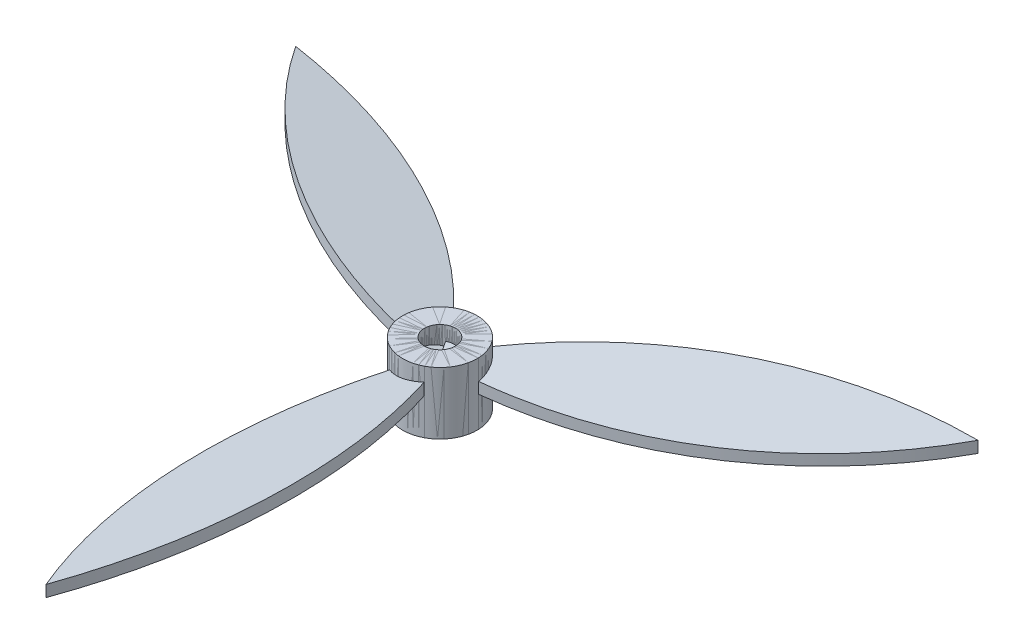
ISO-10303-21;
HEADER;
FILE_DESCRIPTION(('STEP AP214'),'2;1');
FILE_NAME('part.step','',(''),(''),'','','');
FILE_SCHEMA(('AUTOMOTIVE_DESIGN { 1 0 10303 214 1 1 1 1 }'));
ENDSEC;
DATA;
#1=APPLICATION_CONTEXT('core data for automotive mechanical design processes');
#2=APPLICATION_PROTOCOL_DEFINITION('international standard','automotive_design',2000,#1);
#3=PRODUCT_CONTEXT('',#1,'mechanical');
#4=PRODUCT('Part','Part','',(#3));
#5=PRODUCT_RELATED_PRODUCT_CATEGORY('part','',(#4));
#6=PRODUCT_DEFINITION_FORMATION('','',#4);
#7=PRODUCT_DEFINITION_CONTEXT('part definition',#1,'design');
#8=PRODUCT_DEFINITION('design','',#6,#7);
#9=PRODUCT_DEFINITION_SHAPE('','',#8);
#10=(LENGTH_UNIT() NAMED_UNIT(*) SI_UNIT(.MILLI.,.METRE.));
#11=(NAMED_UNIT(*) PLANE_ANGLE_UNIT() SI_UNIT($,.RADIAN.));
#12=(NAMED_UNIT(*) SI_UNIT($,.STERADIAN.) SOLID_ANGLE_UNIT());
#13=UNCERTAINTY_MEASURE_WITH_UNIT(LENGTH_MEASURE(1.E-05),#10,'distance_accuracy_value','');
#14=(GEOMETRIC_REPRESENTATION_CONTEXT(3) GLOBAL_UNCERTAINTY_ASSIGNED_CONTEXT((#13)) GLOBAL_UNIT_ASSIGNED_CONTEXT((#10,
#11,#12)) REPRESENTATION_CONTEXT('',''));
#15=CARTESIAN_POINT('',(0.,0.,0.));
#16=DIRECTION('',(0.,0.,1.));
#17=DIRECTION('',(1.,0.,0.));
#18=AXIS2_PLACEMENT_3D('',#15,#16,#17);
#19=CARTESIAN_POINT('',(16.7891327902085,49.4943574566889,36.4240507759336));
#20=DIRECTION('',(0.0866585890211673,0.984866059825112,-0.150097079096896));
#21=DIRECTION('',(0.492433029912548,-0.173317178042337,-0.852919027133636));
#22=AXIS2_PLACEMENT_3D('',#19,#20,#21);
#23=PLANE('',#22);
#24=CARTESIAN_POINT('',(85.1220420168804,35.3298539377287,-17.0647001118807));
#25=DIRECTION('',(0.0866585890211673,0.984866059825112,-0.150097079096896));
#26=DIRECTION('',(-0.492433029912548,0.173317178042337,0.852919027133636));
#27=AXIS2_PLACEMENT_3D('',#24,#25,#26);
#28=ELLIPSE('',#27,76.945054789548,75.7805729336095);
#29=CARTESIAN_POINT('',(22.7891327902084,47.382591987913,26.0317459305203));
#30=VERTEX_POINT('',#29);
#31=CARTESIAN_POINT('',(71.7868898828023,47.8722241855847,57.53334913679));
#32=VERTEX_POINT('',#31);
#33=EDGE_CURVE('E103',#30,#32,#28,.T.);
#34=ORIENTED_EDGE('',*,*,#33,.F.);
#35=CARTESIAN_POINT('',(16.6329703180013,59.4353300380974,101.561851833808));
#36=DIRECTION('',(0.0866585890211673,0.984866059825112,-0.150097079096896));
#37=DIRECTION('',(-0.492433029912548,0.173317178042337,0.852919027133636));
#38=AXIS2_PLACEMENT_3D('',#35,#36,#37);
#39=ELLIPSE('',#38,76.945054789548,75.7805729336095);
#40=CARTESIAN_POINT('',(74.5691999730728,46.8929597902414,52.7142466980299));
#41=VERTEX_POINT('',#40);
#42=EDGE_CURVE('E90',#30,#41,#39,.F.);
#43=ORIENTED_EDGE('',*,*,#42,.T.);
#44=CARTESIAN_POINT('',(77.7817459305206,47.382591987913,57.7817459305198));
#45=DIRECTION('',(0.0866585890211673,0.984866059825112,-0.150097079096896));
#46=DIRECTION('',(0.492433029912548,-0.173317178042337,-0.852919027133636));
#47=AXIS2_PLACEMENT_3D('',#44,#45,#46);
#48=ELLIPSE('',#47,6.09219897481842,6.);
#49=EDGE_CURVE('E102',#41,#32,#48,.T.);
#50=ORIENTED_EDGE('',*,*,#49,.T.);
#51=EDGE_LOOP('',(#34,#43,#50));
#52=FACE_BOUND('',#51,.T.);
#53=ADVANCED_FACE('F44',(#52),#23,.F.);
#54=CARTESIAN_POINT('',(28.9420742036271,46.8638642813067,15.3745387864843));
#55=DIRECTION('',(-0.094283814011131,-0.982060206739921,0.163304356198657));
#56=DIRECTION('',(-0.491030103369953,0.188567628022265,0.850489087082574));
#57=AXIS2_PLACEMENT_3D('',#54,#55,#56);
#58=PLANE('',#57);
#59=CARTESIAN_POINT('',(85.1220420168804,36.0760015946622,-17.0647001118807));
#60=DIRECTION('',(-0.094283814011131,-0.982060206739921,0.163304356198657));
#61=DIRECTION('',(-0.491030103369953,0.188567628022265,0.850489087082574));
#62=AXIS2_PLACEMENT_3D('',#59,#60,#61);
#63=ELLIPSE('',#62,77.164895200441,75.7805729336095);
#64=CARTESIAN_POINT('',(71.7868898828023,49.7609827369727,57.53334913679));
#65=VERTEX_POINT('',#64);
#66=CARTESIAN_POINT('',(22.7891327902084,49.2267450084261,26.0317459305203));
#67=VERTEX_POINT('',#66);
#68=EDGE_CURVE('E104',#65,#67,#63,.T.);
#69=ORIENTED_EDGE('',*,*,#68,.F.);
#70=CARTESIAN_POINT('',(77.7817459305206,49.2267450084261,57.7817459305198));
#71=DIRECTION('',(-0.094283814011131,-0.982060206739921,0.163304356198657));
#72=DIRECTION('',(0.491030103369953,-0.188567628022265,-0.850489087082574));
#73=AXIS2_PLACEMENT_3D('',#70,#71,#72);
#74=ELLIPSE('',#73,6.1096050515251,6.);
#75=CARTESIAN_POINT('',(74.5691999730728,48.6925072798795,52.7142466980299));
#76=VERTEX_POINT('',#75);
#77=EDGE_CURVE('E109',#65,#76,#74,.T.);
#78=ORIENTED_EDGE('',*,*,#77,.T.);
#79=CARTESIAN_POINT('',(16.6329703180013,62.3774884221901,101.561851833808));
#80=DIRECTION('',(-0.094283814011131,-0.982060206739921,0.163304356198657));
#81=DIRECTION('',(-0.491030103369953,0.188567628022265,0.850489087082574));
#82=AXIS2_PLACEMENT_3D('',#79,#80,#81);
#83=ELLIPSE('',#82,77.164895200441,75.7805729336095);
#84=EDGE_CURVE('E92',#76,#67,#83,.F.);
#85=ORIENTED_EDGE('',*,*,#84,.T.);
#86=EDGE_LOOP('',(#69,#78,#85));
#87=FACE_BOUND('',#86,.T.);
#88=ADVANCED_FACE('F152',(#87),#58,.F.);
#89=CARTESIAN_POINT('',(77.7817459305206,52.,57.7817459305198));
#90=DIRECTION('',(0.,1.,0.));
#91=DIRECTION('',(-0.866025403784443,0.,-0.499999999999992));
#92=AXIS2_PLACEMENT_3D('',#89,#90,#91);
#93=PLANE('',#92);
#94=CARTESIAN_POINT('',(77.7817459305206,52.,57.7817459305198));
#95=DIRECTION('',(0.,1.,0.));
#96=DIRECTION('',(-0.866025403784443,0.,-0.499999999999992));
#97=AXIS2_PLACEMENT_3D('',#94,#95,#96);
#98=CIRCLE('',#97,6.);
#99=CARTESIAN_POINT('',(72.585593507814,52.,54.7817459305199));
#100=VERTEX_POINT('',#99);
#101=EDGE_CURVE('E121',#100,#100,#98,.T.);
#102=ORIENTED_EDGE('',*,*,#101,.T.);
#103=EDGE_LOOP('',(#102));
#104=FACE_BOUND('',#103,.T.);
#105=CARTESIAN_POINT('',(77.7817459305206,52.,57.7817459305198));
#106=DIRECTION('',(0.,1.,0.));
#107=DIRECTION('',(-0.866025403784443,0.,-0.499999999999992));
#108=AXIS2_PLACEMENT_3D('',#105,#106,#107);
#109=CIRCLE('',#108,2.50000000000001);
#110=CARTESIAN_POINT('',(75.6166824210595,52.,56.5317459305198));
#111=VERTEX_POINT('',#110);
#112=EDGE_CURVE('E112',#111,#111,#109,.T.);
#113=ORIENTED_EDGE('',*,*,#112,.F.);
#114=EDGE_LOOP('',(#113));
#115=FACE_BOUND('',#114,.T.);
#116=ADVANCED_FACE('F154',(#104,#115),#93,.T.);
#117=CARTESIAN_POINT('',(77.7817459305206,42.,57.7817459305198));
#118=DIRECTION('',(0.,1.,0.));
#119=DIRECTION('',(-0.866025403784443,0.,-0.499999999999992));
#120=AXIS2_PLACEMENT_3D('',#117,#118,#119);
#121=PLANE('',#120);
#122=CARTESIAN_POINT('',(77.7817459305206,42.,57.7817459305198));
#123=DIRECTION('',(0.,1.,0.));
#124=DIRECTION('',(-0.866025403784443,0.,-0.499999999999992));
#125=AXIS2_PLACEMENT_3D('',#122,#123,#124);
#126=CIRCLE('',#125,6.);
#127=CARTESIAN_POINT('',(72.585593507814,42.,54.7817459305199));
#128=VERTEX_POINT('',#127);
#129=EDGE_CURVE('E119',#128,#128,#126,.T.);
#130=ORIENTED_EDGE('',*,*,#129,.F.);
#131=EDGE_LOOP('',(#130));
#132=FACE_BOUND('',#131,.T.);
#133=CARTESIAN_POINT('',(77.7817459305206,42.,57.7817459305198));
#134=DIRECTION('',(0.,1.,0.));
#135=DIRECTION('',(-0.866025403784443,0.,-0.499999999999992));
#136=AXIS2_PLACEMENT_3D('',#133,#134,#135);
#137=CIRCLE('',#136,2.50000000000001);
#138=CARTESIAN_POINT('',(75.6166824210595,42.,56.5317459305198));
#139=VERTEX_POINT('',#138);
#140=EDGE_CURVE('E108',#139,#139,#137,.T.);
#141=ORIENTED_EDGE('',*,*,#140,.T.);
#142=EDGE_LOOP('',(#141));
#143=FACE_BOUND('',#142,.T.);
#144=ADVANCED_FACE('F160',(#132,#143),#121,.F.);
#145=CARTESIAN_POINT('',(77.7817459305206,52.,57.7817459305198));
#146=DIRECTION('',(0.,-1.,0.));
#147=DIRECTION('',(0.866025403784443,0.,0.499999999999992));
#148=AXIS2_PLACEMENT_3D('',#145,#146,#147);
#149=CYLINDRICAL_SURFACE('',#148,6.);
#150=ORIENTED_EDGE('',*,*,#77,.F.);
#151=DIRECTION('',(0.,1.,0.));
#152=VECTOR('',#151,1.);
#153=CARTESIAN_POINT('',(71.7868898828023,42.,57.53334913679));
#154=LINE('',#153,#152);
#155=EDGE_CURVE('E97',#32,#65,#154,.T.);
#156=ORIENTED_EDGE('',*,*,#155,.F.);
#157=ORIENTED_EDGE('',*,*,#49,.F.);
#158=DIRECTION('',(0.,1.,0.));
#159=VECTOR('',#158,1.);
#160=CARTESIAN_POINT('',(74.5691999730728,42.,52.7142466980299));
#161=LINE('',#160,#159);
#162=EDGE_CURVE('E87',#41,#76,#161,.T.);
#163=ORIENTED_EDGE('',*,*,#162,.T.);
#164=EDGE_LOOP('',(#150,#156,#157,#163));
#165=FACE_BOUND('',#164,.T.);
#166=ORIENTED_EDGE('',*,*,#129,.T.);
#167=EDGE_LOOP('',(#166));
#168=FACE_BOUND('',#167,.T.);
#169=ORIENTED_EDGE('',*,*,#101,.F.);
#170=EDGE_LOOP('',(#169));
#171=FACE_BOUND('',#170,.T.);
#172=ADVANCED_FACE('F46',(#165,#168,#171),#149,.T.);
#173=CARTESIAN_POINT('',(77.7817459305206,52.,57.7817459305198));
#174=DIRECTION('',(0.,-1.,0.));
#175=DIRECTION('',(0.866025403784443,0.,0.499999999999992));
#176=AXIS2_PLACEMENT_3D('',#173,#174,#175);
#177=CYLINDRICAL_SURFACE('',#176,2.50000000000001);
#178=DIRECTION('',(0.,-1.,0.));
#179=VECTOR('',#178,1.);
#180=CARTESIAN_POINT('',(76.5317459305206,52.,59.9468094399809));
#181=LINE('',#180,#179);
#182=CARTESIAN_POINT('',(76.5317459305206,49.7067757303923,59.9468094399809));
#183=VERTEX_POINT('',#182);
#184=CARTESIAN_POINT('',(76.5317459305206,47.8225431272414,59.9468094399809));
#185=VERTEX_POINT('',#184);
#186=EDGE_CURVE('E12',#183,#185,#181,.T.);
#187=ORIENTED_EDGE('',*,*,#186,.F.);
#188=CARTESIAN_POINT('',(77.7817459305206,49.2267450084261,57.7817459305198));
#189=DIRECTION('',(-0.094283814011131,-0.982060206739921,0.163304356198657));
#190=DIRECTION('',(0.491030103369953,-0.188567628022265,-0.850489087082574));
#191=AXIS2_PLACEMENT_3D('',#188,#189,#190);
#192=ELLIPSE('',#191,2.5456687714688,2.50000000000001);
#193=CARTESIAN_POINT('',(79.0317459305206,48.7467142864599,55.6166824210587));
#194=VERTEX_POINT('',#193);
#195=EDGE_CURVE('E129',#183,#194,#192,.T.);
#196=ORIENTED_EDGE('',*,*,#195,.T.);
#197=DIRECTION('',(0.,-1.,0.));
#198=VECTOR('',#197,1.);
#199=CARTESIAN_POINT('',(79.0317459305206,52.,55.6166824210587));
#200=LINE('',#199,#198);
#201=CARTESIAN_POINT('',(79.0317459305206,46.9426408485847,55.6166824210587));
#202=VERTEX_POINT('',#201);
#203=EDGE_CURVE('E124',#202,#194,#200,.F.);
#204=ORIENTED_EDGE('',*,*,#203,.F.);
#205=CARTESIAN_POINT('',(77.7817459305206,47.382591987913,57.7817459305198));
#206=DIRECTION('',(0.0866585890211673,0.984866059825112,-0.150097079096896));
#207=DIRECTION('',(0.492433029912548,-0.173317178042337,-0.852919027133636));
#208=AXIS2_PLACEMENT_3D('',#205,#206,#207);
#209=ELLIPSE('',#208,2.53841623950768,2.50000000000001);
#210=EDGE_CURVE('E52',#202,#185,#209,.T.);
#211=ORIENTED_EDGE('',*,*,#210,.T.);
#212=EDGE_LOOP('',(#187,#196,#204,#211));
#213=FACE_BOUND('',#212,.T.);
#214=ORIENTED_EDGE('',*,*,#112,.T.);
#215=EDGE_LOOP('',(#214));
#216=FACE_BOUND('',#215,.T.);
#217=ORIENTED_EDGE('',*,*,#140,.F.);
#218=EDGE_LOOP('',(#217));
#219=FACE_BOUND('',#218,.T.);
#220=ADVANCED_FACE('F131',(#213,#216,#219),#177,.F.);
#221=CARTESIAN_POINT('',(116.67261889578,0.,-9.57922199601832));
#222=DIRECTION('',(0.866025403784443,0.,0.499999999999992));
#223=DIRECTION('',(0.499999999999992,0.,-0.866025403784443));
#224=AXIS2_PLACEMENT_3D('',#221,#222,#223);
#225=PLANE('',#224);
#226=DIRECTION('',(0.491030103369953,-0.188567628022265,-0.850489087082574));
#227=VECTOR('',#226,1.);
#228=CARTESIAN_POINT('',(83.9346873439392,46.8638642813067,47.1245387864838));
#229=LINE('',#228,#227);
#230=EDGE_CURVE('E114',#183,#194,#229,.T.);
#231=ORIENTED_EDGE('',*,*,#230,.F.);
#232=ORIENTED_EDGE('',*,*,#186,.T.);
#233=DIRECTION('',(-0.492433029912548,0.173317178042337,0.852919027133636));
#234=VECTOR('',#233,1.);
#235=CARTESIAN_POINT('',(71.7817459305207,49.4943574566889,68.1740507759331));
#236=LINE('',#235,#234);
#237=EDGE_CURVE('E140',#202,#185,#236,.T.);
#238=ORIENTED_EDGE('',*,*,#237,.F.);
#239=ORIENTED_EDGE('',*,*,#203,.T.);
#240=EDGE_LOOP('',(#231,#232,#238,#239));
#241=FACE_BOUND('',#240,.T.);
#242=ADVANCED_FACE('F138',(#241),#225,.T.);
#243=ORIENTED_EDGE('',*,*,#195,.F.);
#244=ORIENTED_EDGE('',*,*,#230,.T.);
#245=EDGE_LOOP('',(#243,#244));
#246=FACE_BOUND('',#245,.T.);
#247=ADVANCED_FACE('F141',(#246),#58,.F.);
#248=ORIENTED_EDGE('',*,*,#210,.F.);
#249=ORIENTED_EDGE('',*,*,#237,.T.);
#250=EDGE_LOOP('',(#248,#249));
#251=FACE_BOUND('',#250,.T.);
#252=ADVANCED_FACE('F164',(#251),#23,.F.);
#253=CARTESIAN_POINT('',(85.1220420168804,42.,-17.0647001118807));
#254=DIRECTION('',(0.,1.,0.));
#255=DIRECTION('',(-0.866025403784443,0.,-0.499999999999992));
#256=AXIS2_PLACEMENT_3D('',#253,#254,#255);
#257=CYLINDRICAL_SURFACE('',#256,75.7805729336095);
#258=ORIENTED_EDGE('',*,*,#33,.T.);
#259=ORIENTED_EDGE('',*,*,#155,.T.);
#260=ORIENTED_EDGE('',*,*,#68,.T.);
#261=DIRECTION('',(0.,1.,0.));
#262=VECTOR('',#261,1.);
#263=CARTESIAN_POINT('',(22.7891327902084,42.,26.0317459305203));
#264=LINE('',#263,#262);
#265=EDGE_CURVE('E59',#30,#67,#264,.T.);
#266=ORIENTED_EDGE('',*,*,#265,.F.);
#267=EDGE_LOOP('',(#258,#259,#260,#266));
#268=FACE_BOUND('',#267,.T.);
#269=ADVANCED_FACE('F150',(#268),#257,.T.);
#270=CARTESIAN_POINT('',(16.6329703180013,42.,101.561851833808));
#271=DIRECTION('',(0.,1.,0.));
#272=DIRECTION('',(-0.866025403784443,0.,-0.499999999999992));
#273=AXIS2_PLACEMENT_3D('',#270,#271,#272);
#274=CYLINDRICAL_SURFACE('',#273,75.7805729336095);
#275=ORIENTED_EDGE('',*,*,#265,.T.);
#276=ORIENTED_EDGE('',*,*,#84,.F.);
#277=ORIENTED_EDGE('',*,*,#162,.F.);
#278=ORIENTED_EDGE('',*,*,#42,.F.);
#279=EDGE_LOOP('',(#275,#276,#277,#278));
#280=FACE_BOUND('',#279,.T.);
#281=ADVANCED_FACE('F89',(#280),#274,.T.);
#282=CLOSED_SHELL('',(#53,#88,#116,#144,#172,#220,#242,#247,#252,#269,#281));
#283=MANIFOLD_SOLID_BREP('B2',#282);
#284=CARTESIAN_POINT('',(126.774359070832,49.4943574566889,15.6394410851063));
#285=DIRECTION('',(0.0866585890211694,0.984866059825112,0.150097079096894));
#286=DIRECTION('',(0.49243302991256,-0.173317178042337,0.85291902713363));
#287=AXIS2_PLACEMENT_3D('',#284,#285,#286);
#288=PLANE('',#287);
#289=CARTESIAN_POINT('',(138.930521543041,35.3298539377287,101.561851833807));
#290=DIRECTION('',(0.0866585890211694,0.984866059825112,0.150097079096894));
#291=DIRECTION('',(-0.49243302991256,0.173317178042337,-0.85291902713363));
#292=AXIS2_PLACEMENT_3D('',#289,#290,#291);
#293=ELLIPSE('',#292,76.945054789548,75.7805729336095);
#294=CARTESIAN_POINT('',(132.774359070832,47.382591987913,26.0317459305195));
#295=VERTEX_POINT('',#294);
#296=CARTESIAN_POINT('',(80.9942918879684,47.8722241855847,52.7142466980299));
#297=VERTEX_POINT('',#296);
#298=EDGE_CURVE('E328',#295,#297,#293,.T.);
#299=ORIENTED_EDGE('',*,*,#298,.F.);
#300=CARTESIAN_POINT('',(70.4414498441598,59.4353300380974,-17.0647001118806));
#301=DIRECTION('',(0.0866585890211694,0.984866059825112,0.150097079096894));
#302=DIRECTION('',(-0.49243302991256,0.173317178042337,-0.85291902713363));
#303=AXIS2_PLACEMENT_3D('',#300,#301,#302);
#304=ELLIPSE('',#303,76.945054789548,75.7805729336095);
#305=CARTESIAN_POINT('',(83.7766019782389,46.8929597902414,57.5333491367899));
#306=VERTEX_POINT('',#305);
#307=EDGE_CURVE('E315',#295,#306,#304,.F.);
#308=ORIENTED_EDGE('',*,*,#307,.T.);
#309=CARTESIAN_POINT('',(77.7817459305206,47.382591987913,57.7817459305198));
#310=DIRECTION('',(0.0866585890211694,0.984866059825112,0.150097079096894));
#311=DIRECTION('',(0.49243302991256,-0.173317178042337,0.85291902713363));
#312=AXIS2_PLACEMENT_3D('',#309,#310,#311);
#313=ELLIPSE('',#312,6.09219897481842,6.);
#314=EDGE_CURVE('E327',#306,#297,#313,.T.);
#315=ORIENTED_EDGE('',*,*,#314,.T.);
#316=EDGE_LOOP('',(#299,#308,#315));
#317=FACE_BOUND('',#316,.T.);
#318=ADVANCED_FACE('F269',(#317),#288,.F.);
#319=CARTESIAN_POINT('',(138.927300484251,46.8638642813067,36.6889530745554));
#320=DIRECTION('',(-0.0942838140111333,-0.982060206739921,-0.163304356198655));
#321=DIRECTION('',(-0.491030103369965,0.188567628022265,-0.850489087082567));
#322=AXIS2_PLACEMENT_3D('',#319,#320,#321);
#323=PLANE('',#322);
#324=CARTESIAN_POINT('',(138.930521543041,36.0760015946622,101.561851833807));
#325=DIRECTION('',(-0.0942838140111333,-0.982060206739921,-0.163304356198655));
#326=DIRECTION('',(-0.491030103369965,0.188567628022265,-0.850489087082567));
#327=AXIS2_PLACEMENT_3D('',#324,#325,#326);
#328=ELLIPSE('',#327,77.164895200441,75.7805729336095);
#329=CARTESIAN_POINT('',(80.9942918879684,49.7609827369727,52.7142466980299));
#330=VERTEX_POINT('',#329);
#331=CARTESIAN_POINT('',(132.774359070832,49.2267450084261,26.0317459305195));
#332=VERTEX_POINT('',#331);
#333=EDGE_CURVE('E329',#330,#332,#328,.T.);
#334=ORIENTED_EDGE('',*,*,#333,.F.);
#335=CARTESIAN_POINT('',(77.7817459305206,49.2267450084261,57.7817459305198));
#336=DIRECTION('',(-0.0942838140111333,-0.982060206739921,-0.163304356198655));
#337=DIRECTION('',(0.491030103369965,-0.188567628022265,0.850489087082567));
#338=AXIS2_PLACEMENT_3D('',#335,#336,#337);
#339=ELLIPSE('',#338,6.1096050515251,6.);
#340=CARTESIAN_POINT('',(83.7766019782389,48.6925072798795,57.5333491367899));
#341=VERTEX_POINT('',#340);
#342=EDGE_CURVE('E334',#330,#341,#339,.T.);
#343=ORIENTED_EDGE('',*,*,#342,.T.);
#344=CARTESIAN_POINT('',(70.4414498441598,62.3774884221901,-17.0647001118806));
#345=DIRECTION('',(-0.0942838140111333,-0.982060206739921,-0.163304356198655));
#346=DIRECTION('',(-0.491030103369965,0.188567628022265,-0.850489087082567));
#347=AXIS2_PLACEMENT_3D('',#344,#345,#346);
#348=ELLIPSE('',#347,77.164895200441,75.7805729336095);
#349=EDGE_CURVE('E317',#341,#332,#348,.F.);
#350=ORIENTED_EDGE('',*,*,#349,.T.);
#351=EDGE_LOOP('',(#334,#343,#350));
#352=FACE_BOUND('',#351,.T.);
#353=ADVANCED_FACE('F377',(#352),#323,.F.);
#354=CARTESIAN_POINT('',(77.7817459305206,52.,57.7817459305198));
#355=DIRECTION('',(0.,1.,0.));
#356=DIRECTION('',(0.866025403784436,0.,-0.500000000000004));
#357=AXIS2_PLACEMENT_3D('',#354,#355,#356);
#358=PLANE('',#357);
#359=CARTESIAN_POINT('',(77.7817459305206,52.,57.7817459305198));
#360=DIRECTION('',(0.,1.,0.));
#361=DIRECTION('',(0.866025403784436,0.,-0.500000000000004));
#362=AXIS2_PLACEMENT_3D('',#359,#360,#361);
#363=CIRCLE('',#362,6.);
#364=CARTESIAN_POINT('',(82.9778983532272,52.,54.7817459305198));
#365=VERTEX_POINT('',#364);
#366=EDGE_CURVE('E346',#365,#365,#363,.T.);
#367=ORIENTED_EDGE('',*,*,#366,.T.);
#368=EDGE_LOOP('',(#367));
#369=FACE_BOUND('',#368,.T.);
#370=CARTESIAN_POINT('',(77.7817459305206,52.,57.7817459305198));
#371=DIRECTION('',(0.,1.,0.));
#372=DIRECTION('',(0.866025403784436,0.,-0.500000000000004));
#373=AXIS2_PLACEMENT_3D('',#370,#371,#372);
#374=CIRCLE('',#373,2.50000000000001);
#375=CARTESIAN_POINT('',(79.9468094399817,52.,56.5317459305198));
#376=VERTEX_POINT('',#375);
#377=EDGE_CURVE('E337',#376,#376,#374,.T.);
#378=ORIENTED_EDGE('',*,*,#377,.F.);
#379=EDGE_LOOP('',(#378));
#380=FACE_BOUND('',#379,.T.);
#381=ADVANCED_FACE('F379',(#369,#380),#358,.T.);
#382=CARTESIAN_POINT('',(77.7817459305206,42.,57.7817459305198));
#383=DIRECTION('',(0.,1.,0.));
#384=DIRECTION('',(0.866025403784436,0.,-0.500000000000004));
#385=AXIS2_PLACEMENT_3D('',#382,#383,#384);
#386=PLANE('',#385);
#387=CARTESIAN_POINT('',(77.7817459305206,42.,57.7817459305198));
#388=DIRECTION('',(0.,1.,0.));
#389=DIRECTION('',(0.866025403784436,0.,-0.500000000000004));
#390=AXIS2_PLACEMENT_3D('',#387,#388,#389);
#391=CIRCLE('',#390,6.);
#392=CARTESIAN_POINT('',(82.9778983532272,42.,54.7817459305198));
#393=VERTEX_POINT('',#392);
#394=EDGE_CURVE('E344',#393,#393,#391,.T.);
#395=ORIENTED_EDGE('',*,*,#394,.F.);
#396=EDGE_LOOP('',(#395));
#397=FACE_BOUND('',#396,.T.);
#398=CARTESIAN_POINT('',(77.7817459305206,42.,57.7817459305198));
#399=DIRECTION('',(0.,1.,0.));
#400=DIRECTION('',(0.866025403784436,0.,-0.500000000000004));
#401=AXIS2_PLACEMENT_3D('',#398,#399,#400);
#402=CIRCLE('',#401,2.50000000000001);
#403=CARTESIAN_POINT('',(79.9468094399817,42.,56.5317459305198));
#404=VERTEX_POINT('',#403);
#405=EDGE_CURVE('E333',#404,#404,#402,.T.);
#406=ORIENTED_EDGE('',*,*,#405,.T.);
#407=EDGE_LOOP('',(#406));
#408=FACE_BOUND('',#407,.T.);
#409=ADVANCED_FACE('F385',(#397,#408),#386,.F.);
#410=CARTESIAN_POINT('',(77.7817459305206,52.,57.7817459305198));
#411=DIRECTION('',(0.,-1.,0.));
#412=DIRECTION('',(-0.866025403784436,0.,0.500000000000004));
#413=AXIS2_PLACEMENT_3D('',#410,#411,#412);
#414=CYLINDRICAL_SURFACE('',#413,6.);
#415=ORIENTED_EDGE('',*,*,#342,.F.);
#416=DIRECTION('',(0.,1.,0.));
#417=VECTOR('',#416,1.);
#418=CARTESIAN_POINT('',(80.9942918879684,42.,52.7142466980299));
#419=LINE('',#418,#417);
#420=EDGE_CURVE('E322',#297,#330,#419,.T.);
#421=ORIENTED_EDGE('',*,*,#420,.F.);
#422=ORIENTED_EDGE('',*,*,#314,.F.);
#423=DIRECTION('',(0.,1.,0.));
#424=VECTOR('',#423,1.);
#425=CARTESIAN_POINT('',(83.7766019782389,42.,57.5333491367899));
#426=LINE('',#425,#424);
#427=EDGE_CURVE('E312',#306,#341,#426,.T.);
#428=ORIENTED_EDGE('',*,*,#427,.T.);
#429=EDGE_LOOP('',(#415,#421,#422,#428));
#430=FACE_BOUND('',#429,.T.);
#431=ORIENTED_EDGE('',*,*,#394,.T.);
#432=EDGE_LOOP('',(#431));
#433=FACE_BOUND('',#432,.T.);
#434=ORIENTED_EDGE('',*,*,#366,.F.);
#435=EDGE_LOOP('',(#434));
#436=FACE_BOUND('',#435,.T.);
#437=ADVANCED_FACE('F271',(#430,#433,#436),#414,.T.);
#438=CARTESIAN_POINT('',(77.7817459305206,52.,57.7817459305198));
#439=DIRECTION('',(0.,-1.,0.));
#440=DIRECTION('',(-0.866025403784436,0.,0.500000000000004));
#441=AXIS2_PLACEMENT_3D('',#438,#439,#440);
#442=CYLINDRICAL_SURFACE('',#441,2.50000000000001);
#443=DIRECTION('',(0.,-1.,0.));
#444=VECTOR('',#443,1.);
#445=CARTESIAN_POINT('',(76.5317459305207,52.,55.6166824210587));
#446=LINE('',#445,#444);
#447=CARTESIAN_POINT('',(76.5317459305207,49.7067757303923,55.6166824210587));
#448=VERTEX_POINT('',#447);
#449=CARTESIAN_POINT('',(76.5317459305207,47.8225431272414,55.6166824210587));
#450=VERTEX_POINT('',#449);
#451=EDGE_CURVE('E42',#448,#450,#446,.T.);
#452=ORIENTED_EDGE('',*,*,#451,.F.);
#453=CARTESIAN_POINT('',(77.7817459305206,49.2267450084261,57.7817459305198));
#454=DIRECTION('',(-0.0942838140111333,-0.982060206739921,-0.163304356198655));
#455=DIRECTION('',(0.491030103369965,-0.188567628022265,0.850489087082567));
#456=AXIS2_PLACEMENT_3D('',#453,#454,#455);
#457=ELLIPSE('',#456,2.5456687714688,2.50000000000001);
#458=CARTESIAN_POINT('',(79.0317459305207,48.7467142864599,59.9468094399809));
#459=VERTEX_POINT('',#458);
#460=EDGE_CURVE('E354',#448,#459,#457,.T.);
#461=ORIENTED_EDGE('',*,*,#460,.T.);
#462=DIRECTION('',(0.,-1.,0.));
#463=VECTOR('',#462,1.);
#464=CARTESIAN_POINT('',(79.0317459305207,52.,59.9468094399809));
#465=LINE('',#464,#463);
#466=CARTESIAN_POINT('',(79.0317459305207,46.9426408485847,59.9468094399809));
#467=VERTEX_POINT('',#466);
#468=EDGE_CURVE('E349',#467,#459,#465,.F.);
#469=ORIENTED_EDGE('',*,*,#468,.F.);
#470=CARTESIAN_POINT('',(77.7817459305206,47.382591987913,57.7817459305198));
#471=DIRECTION('',(0.0866585890211694,0.984866059825112,0.150097079096894));
#472=DIRECTION('',(0.49243302991256,-0.173317178042337,0.85291902713363));
#473=AXIS2_PLACEMENT_3D('',#470,#471,#472);
#474=ELLIPSE('',#473,2.53841623950768,2.50000000000001);
#475=EDGE_CURVE('E277',#467,#450,#474,.T.);
#476=ORIENTED_EDGE('',*,*,#475,.T.);
#477=EDGE_LOOP('',(#452,#461,#469,#476));
#478=FACE_BOUND('',#477,.T.);
#479=ORIENTED_EDGE('',*,*,#377,.T.);
#480=EDGE_LOOP('',(#479));
#481=FACE_BOUND('',#480,.T.);
#482=ORIENTED_EDGE('',*,*,#405,.F.);
#483=EDGE_LOOP('',(#482));
#484=FACE_BOUND('',#483,.T.);
#485=ADVANCED_FACE('F356',(#478,#481,#484),#442,.F.);
#486=CARTESIAN_POINT('',(116.672618895781,0.,125.142713857057));
#487=DIRECTION('',(-0.866025403784436,0.,0.500000000000004));
#488=DIRECTION('',(0.500000000000004,0.,0.866025403784436));
#489=AXIS2_PLACEMENT_3D('',#486,#487,#488);
#490=PLANE('',#489);
#491=DIRECTION('',(0.491030103369965,-0.188567628022265,0.850489087082567));
#492=VECTOR('',#491,1.);
#493=CARTESIAN_POINT('',(83.9346873439395,46.8638642813067,68.4389530745557));
#494=LINE('',#493,#492);
#495=EDGE_CURVE('E339',#448,#459,#494,.T.);
#496=ORIENTED_EDGE('',*,*,#495,.F.);
#497=ORIENTED_EDGE('',*,*,#451,.T.);
#498=DIRECTION('',(-0.49243302991256,0.173317178042337,-0.85291902713363));
#499=VECTOR('',#498,1.);
#500=CARTESIAN_POINT('',(71.7817459305206,49.4943574566889,47.3894410851065));
#501=LINE('',#500,#499);
#502=EDGE_CURVE('E365',#467,#450,#501,.T.);
#503=ORIENTED_EDGE('',*,*,#502,.F.);
#504=ORIENTED_EDGE('',*,*,#468,.T.);
#505=EDGE_LOOP('',(#496,#497,#503,#504));
#506=FACE_BOUND('',#505,.T.);
#507=ADVANCED_FACE('F363',(#506),#490,.T.);
#508=ORIENTED_EDGE('',*,*,#460,.F.);
#509=ORIENTED_EDGE('',*,*,#495,.T.);
#510=EDGE_LOOP('',(#508,#509));
#511=FACE_BOUND('',#510,.T.);
#512=ADVANCED_FACE('F366',(#511),#323,.F.);
#513=ORIENTED_EDGE('',*,*,#475,.F.);
#514=ORIENTED_EDGE('',*,*,#502,.T.);
#515=EDGE_LOOP('',(#513,#514));
#516=FACE_BOUND('',#515,.T.);
#517=ADVANCED_FACE('F389',(#516),#288,.F.);
#518=CARTESIAN_POINT('',(138.930521543041,42.,101.561851833807));
#519=DIRECTION('',(0.,1.,0.));
#520=DIRECTION('',(0.866025403784436,0.,-0.500000000000004));
#521=AXIS2_PLACEMENT_3D('',#518,#519,#520);
#522=CYLINDRICAL_SURFACE('',#521,75.7805729336095);
#523=ORIENTED_EDGE('',*,*,#298,.T.);
#524=ORIENTED_EDGE('',*,*,#420,.T.);
#525=ORIENTED_EDGE('',*,*,#333,.T.);
#526=DIRECTION('',(0.,1.,0.));
#527=VECTOR('',#526,1.);
#528=CARTESIAN_POINT('',(132.774359070832,42.,26.0317459305195));
#529=LINE('',#528,#527);
#530=EDGE_CURVE('E284',#295,#332,#529,.T.);
#531=ORIENTED_EDGE('',*,*,#530,.F.);
#532=EDGE_LOOP('',(#523,#524,#525,#531));
#533=FACE_BOUND('',#532,.T.);
#534=ADVANCED_FACE('F375',(#533),#522,.T.);
#535=CARTESIAN_POINT('',(70.4414498441598,42.,-17.0647001118806));
#536=DIRECTION('',(0.,1.,0.));
#537=DIRECTION('',(0.866025403784436,0.,-0.500000000000004));
#538=AXIS2_PLACEMENT_3D('',#535,#536,#537);
#539=CYLINDRICAL_SURFACE('',#538,75.7805729336095);
#540=ORIENTED_EDGE('',*,*,#530,.T.);
#541=ORIENTED_EDGE('',*,*,#349,.F.);
#542=ORIENTED_EDGE('',*,*,#427,.F.);
#543=ORIENTED_EDGE('',*,*,#307,.F.);
#544=EDGE_LOOP('',(#540,#541,#542,#543));
#545=FACE_BOUND('',#544,.T.);
#546=ADVANCED_FACE('F314',(#545),#539,.T.);
#547=CLOSED_SHELL('',(#318,#353,#381,#409,#437,#485,#507,#512,#517,#534,#546));
#548=MANIFOLD_SOLID_BREP('B6',#547);
#549=CARTESIAN_POINT('',(89.7817459305206,49.4943574566889,121.28174593052));
#550=DIRECTION('',(-0.173317178042337,0.984866059825112,0.));
#551=DIRECTION('',(-0.984866059825112,-0.173317178042337,0.));
#552=AXIS2_PLACEMENT_3D('',#549,#550,#551);
#553=PLANE('',#552);
#554=CARTESIAN_POINT('',(9.29267423164037,35.3298539377287,88.8480860696324));
#555=DIRECTION('',(-0.173317178042337,0.984866059825112,0.));
#556=DIRECTION('',(0.984866059825112,0.173317178042337,0.));
#557=AXIS2_PLACEMENT_3D('',#554,#555,#556);
#558=ELLIPSE('',#557,76.945054789548,75.7805729336095);
#559=CARTESIAN_POINT('',(77.7817459305206,47.382591987913,121.28174593052));
#560=VERTEX_POINT('',#559);
#561=CARTESIAN_POINT('',(80.5640560207911,47.8722241855847,63.0976419567396));
#562=VERTEX_POINT('',#561);
#563=EDGE_CURVE('E544',#560,#562,#558,.T.);
#564=ORIENTED_EDGE('',*,*,#563,.F.);
#565=CARTESIAN_POINT('',(146.270817629401,59.4353300380974,88.8480860696324));
#566=DIRECTION('',(-0.173317178042337,0.984866059825112,0.));
#567=DIRECTION('',(0.984866059825112,0.173317178042337,0.));
#568=AXIS2_PLACEMENT_3D('',#565,#566,#567);
#569=ELLIPSE('',#568,76.945054789548,75.7805729336095);
#570=CARTESIAN_POINT('',(74.9994358402501,46.8929597902414,63.0976419567396));
#571=VERTEX_POINT('',#570);
#572=EDGE_CURVE('E531',#560,#571,#569,.F.);
#573=ORIENTED_EDGE('',*,*,#572,.T.);
#574=CARTESIAN_POINT('',(77.7817459305206,47.382591987913,57.7817459305198));
#575=DIRECTION('',(-0.173317178042337,0.984866059825112,0.));
#576=DIRECTION('',(-0.984866059825112,-0.173317178042337,0.));
#577=AXIS2_PLACEMENT_3D('',#574,#575,#576);
#578=ELLIPSE('',#577,6.09219897481842,6.);
#579=EDGE_CURVE('E543',#571,#562,#578,.T.);
#580=ORIENTED_EDGE('',*,*,#579,.T.);
#581=EDGE_LOOP('',(#564,#573,#580));
#582=FACE_BOUND('',#581,.T.);
#583=ADVANCED_FACE('F485',(#582),#553,.F.);
#584=CARTESIAN_POINT('',(65.4758631036832,46.8638642813067,121.28174593052));
#585=DIRECTION('',(0.188567628022265,-0.982060206739921,0.));
#586=DIRECTION('',(0.982060206739921,0.188567628022265,0.));
#587=AXIS2_PLACEMENT_3D('',#584,#585,#586);
#588=PLANE('',#587);
#589=CARTESIAN_POINT('',(9.29267423164037,36.0760015946622,88.8480860696324));
#590=DIRECTION('',(0.188567628022265,-0.982060206739921,0.));
#591=DIRECTION('',(0.982060206739921,0.188567628022265,0.));
#592=AXIS2_PLACEMENT_3D('',#589,#590,#591);
#593=ELLIPSE('',#592,77.164895200441,75.7805729336095);
#594=CARTESIAN_POINT('',(80.5640560207911,49.7609827369727,63.0976419567396));
#595=VERTEX_POINT('',#594);
#596=CARTESIAN_POINT('',(77.7817459305206,49.2267450084261,121.28174593052));
#597=VERTEX_POINT('',#596);
#598=EDGE_CURVE('E545',#595,#597,#593,.T.);
#599=ORIENTED_EDGE('',*,*,#598,.F.);
#600=CARTESIAN_POINT('',(77.7817459305206,49.2267450084261,57.7817459305198));
#601=DIRECTION('',(0.188567628022265,-0.982060206739921,0.));
#602=DIRECTION('',(-0.982060206739921,-0.188567628022265,0.));
#603=AXIS2_PLACEMENT_3D('',#600,#601,#602);
#604=ELLIPSE('',#603,6.1096050515251,6.);
#605=CARTESIAN_POINT('',(74.9994358402501,48.6925072798795,63.0976419567396));
#606=VERTEX_POINT('',#605);
#607=EDGE_CURVE('E550',#595,#606,#604,.T.);
#608=ORIENTED_EDGE('',*,*,#607,.T.);
#609=CARTESIAN_POINT('',(146.270817629401,62.3774884221901,88.8480860696324));
#610=DIRECTION('',(0.188567628022265,-0.982060206739921,0.));
#611=DIRECTION('',(0.982060206739921,0.188567628022265,0.));
#612=AXIS2_PLACEMENT_3D('',#609,#610,#611);
#613=ELLIPSE('',#612,77.164895200441,75.7805729336095);
#614=EDGE_CURVE('E533',#606,#597,#613,.F.);
#615=ORIENTED_EDGE('',*,*,#614,.T.);
#616=EDGE_LOOP('',(#599,#608,#615));
#617=FACE_BOUND('',#616,.T.);
#618=ADVANCED_FACE('F593',(#617),#588,.F.);
#619=CARTESIAN_POINT('',(77.7817459305206,52.,57.7817459305198));
#620=DIRECTION('',(0.,1.,0.));
#621=DIRECTION('',(0.,0.,1.));
#622=AXIS2_PLACEMENT_3D('',#619,#620,#621);
#623=PLANE('',#622);
#624=CARTESIAN_POINT('',(77.7817459305206,52.,57.7817459305198));
#625=DIRECTION('',(0.,1.,0.));
#626=DIRECTION('',(0.,0.,1.));
#627=AXIS2_PLACEMENT_3D('',#624,#625,#626);
#628=CIRCLE('',#627,6.);
#629=CARTESIAN_POINT('',(77.7817459305206,52.,63.7817459305198));
#630=VERTEX_POINT('',#629);
#631=EDGE_CURVE('E562',#630,#630,#628,.T.);
#632=ORIENTED_EDGE('',*,*,#631,.T.);
#633=EDGE_LOOP('',(#632));
#634=FACE_BOUND('',#633,.T.);
#635=CARTESIAN_POINT('',(77.7817459305206,52.,57.7817459305198));
#636=DIRECTION('',(0.,1.,0.));
#637=DIRECTION('',(0.,0.,1.));
#638=AXIS2_PLACEMENT_3D('',#635,#636,#637);
#639=CIRCLE('',#638,2.50000000000001);
#640=CARTESIAN_POINT('',(77.7817459305206,52.,60.2817459305198));
#641=VERTEX_POINT('',#640);
#642=EDGE_CURVE('E553',#641,#641,#639,.T.);
#643=ORIENTED_EDGE('',*,*,#642,.F.);
#644=EDGE_LOOP('',(#643));
#645=FACE_BOUND('',#644,.T.);
#646=ADVANCED_FACE('F595',(#634,#645),#623,.T.);
#647=CARTESIAN_POINT('',(77.7817459305206,42.,57.7817459305198));
#648=DIRECTION('',(0.,1.,0.));
#649=DIRECTION('',(0.,0.,1.));
#650=AXIS2_PLACEMENT_3D('',#647,#648,#649);
#651=PLANE('',#650);
#652=CARTESIAN_POINT('',(77.7817459305206,42.,57.7817459305198));
#653=DIRECTION('',(0.,1.,0.));
#654=DIRECTION('',(0.,0.,1.));
#655=AXIS2_PLACEMENT_3D('',#652,#653,#654);
#656=CIRCLE('',#655,6.);
#657=CARTESIAN_POINT('',(77.7817459305206,42.,63.7817459305198));
#658=VERTEX_POINT('',#657);
#659=EDGE_CURVE('E560',#658,#658,#656,.T.);
#660=ORIENTED_EDGE('',*,*,#659,.F.);
#661=EDGE_LOOP('',(#660));
#662=FACE_BOUND('',#661,.T.);
#663=CARTESIAN_POINT('',(77.7817459305206,42.,57.7817459305198));
#664=DIRECTION('',(0.,1.,0.));
#665=DIRECTION('',(0.,0.,1.));
#666=AXIS2_PLACEMENT_3D('',#663,#664,#665);
#667=CIRCLE('',#666,2.50000000000001);
#668=CARTESIAN_POINT('',(77.7817459305206,42.,60.2817459305198));
#669=VERTEX_POINT('',#668);
#670=EDGE_CURVE('E549',#669,#669,#667,.T.);
#671=ORIENTED_EDGE('',*,*,#670,.T.);
#672=EDGE_LOOP('',(#671));
#673=FACE_BOUND('',#672,.T.);
#674=ADVANCED_FACE('F601',(#662,#673),#651,.F.);
#675=CARTESIAN_POINT('',(77.7817459305206,52.,57.7817459305198));
#676=DIRECTION('',(0.,-1.,0.));
#677=DIRECTION('',(0.,0.,-1.));
#678=AXIS2_PLACEMENT_3D('',#675,#676,#677);
#679=CYLINDRICAL_SURFACE('',#678,6.);
#680=ORIENTED_EDGE('',*,*,#607,.F.);
#681=DIRECTION('',(0.,1.,0.));
#682=VECTOR('',#681,1.);
#683=CARTESIAN_POINT('',(80.5640560207911,42.,63.0976419567396));
#684=LINE('',#683,#682);
#685=EDGE_CURVE('E538',#562,#595,#684,.T.);
#686=ORIENTED_EDGE('',*,*,#685,.F.);
#687=ORIENTED_EDGE('',*,*,#579,.F.);
#688=DIRECTION('',(0.,1.,0.));
#689=VECTOR('',#688,1.);
#690=CARTESIAN_POINT('',(74.9994358402501,42.,63.0976419567396));
#691=LINE('',#690,#689);
#692=EDGE_CURVE('E528',#571,#606,#691,.T.);
#693=ORIENTED_EDGE('',*,*,#692,.T.);
#694=EDGE_LOOP('',(#680,#686,#687,#693));
#695=FACE_BOUND('',#694,.T.);
#696=ORIENTED_EDGE('',*,*,#659,.T.);
#697=EDGE_LOOP('',(#696));
#698=FACE_BOUND('',#697,.T.);
#699=ORIENTED_EDGE('',*,*,#631,.F.);
#700=EDGE_LOOP('',(#699));
#701=FACE_BOUND('',#700,.T.);
#702=ADVANCED_FACE('F487',(#695,#698,#701),#679,.T.);
#703=CARTESIAN_POINT('',(77.7817459305206,52.,57.7817459305198));
#704=DIRECTION('',(0.,-1.,0.));
#705=DIRECTION('',(0.,0.,-1.));
#706=AXIS2_PLACEMENT_3D('',#703,#704,#705);
#707=CYLINDRICAL_SURFACE('',#706,2.50000000000001);
#708=DIRECTION('',(0.,-1.,0.));
#709=VECTOR('',#708,1.);
#710=CARTESIAN_POINT('',(80.2817459305206,52.,57.7817459305199));
#711=LINE('',#710,#709);
#712=CARTESIAN_POINT('',(80.2817459305206,49.7067757303923,57.7817459305199));
#713=VERTEX_POINT('',#712);
#714=CARTESIAN_POINT('',(80.2817459305206,47.8225431272414,57.7817459305199));
#715=VERTEX_POINT('',#714);
#716=EDGE_CURVE('E267',#713,#715,#711,.T.);
#717=ORIENTED_EDGE('',*,*,#716,.F.);
#718=CARTESIAN_POINT('',(77.7817459305206,49.2267450084261,57.7817459305198));
#719=DIRECTION('',(0.188567628022265,-0.982060206739921,0.));
#720=DIRECTION('',(-0.982060206739921,-0.188567628022265,0.));
#721=AXIS2_PLACEMENT_3D('',#718,#719,#720);
#722=ELLIPSE('',#721,2.5456687714688,2.50000000000001);
#723=CARTESIAN_POINT('',(75.2817459305206,48.7467142864599,57.7817459305199));
#724=VERTEX_POINT('',#723);
#725=EDGE_CURVE('E570',#713,#724,#722,.T.);
#726=ORIENTED_EDGE('',*,*,#725,.T.);
#727=DIRECTION('',(0.,-1.,0.));
#728=VECTOR('',#727,1.);
#729=CARTESIAN_POINT('',(75.2817459305206,52.,57.7817459305199));
#730=LINE('',#729,#728);
#731=CARTESIAN_POINT('',(75.2817459305206,46.9426408485847,57.7817459305199));
#732=VERTEX_POINT('',#731);
#733=EDGE_CURVE('E565',#732,#724,#730,.F.);
#734=ORIENTED_EDGE('',*,*,#733,.F.);
#735=CARTESIAN_POINT('',(77.7817459305206,47.382591987913,57.7817459305198));
#736=DIRECTION('',(-0.173317178042337,0.984866059825112,0.));
#737=DIRECTION('',(-0.984866059825112,-0.173317178042337,0.));
#738=AXIS2_PLACEMENT_3D('',#735,#736,#737);
#739=ELLIPSE('',#738,2.53841623950768,2.50000000000001);
#740=EDGE_CURVE('E493',#732,#715,#739,.T.);
#741=ORIENTED_EDGE('',*,*,#740,.T.);
#742=EDGE_LOOP('',(#717,#726,#734,#741));
#743=FACE_BOUND('',#742,.T.);
#744=ORIENTED_EDGE('',*,*,#642,.T.);
#745=EDGE_LOOP('',(#744));
#746=FACE_BOUND('',#745,.T.);
#747=ORIENTED_EDGE('',*,*,#670,.F.);
#748=EDGE_LOOP('',(#747));
#749=FACE_BOUND('',#748,.T.);
#750=ADVANCED_FACE('F572',(#743,#746,#749),#707,.F.);
#751=CARTESIAN_POINT('',(0.,0.,57.7817459305199));
#752=DIRECTION('',(0.,0.,-1.));
#753=DIRECTION('',(-1.,0.,0.));
#754=AXIS2_PLACEMENT_3D('',#751,#752,#753);
#755=PLANE('',#754);
#756=DIRECTION('',(-0.982060206739921,-0.188567628022265,0.));
#757=VECTOR('',#756,1.);
#758=CARTESIAN_POINT('',(65.4758631036832,46.8638642813067,57.7817459305199));
#759=LINE('',#758,#757);
#760=EDGE_CURVE('E555',#713,#724,#759,.T.);
#761=ORIENTED_EDGE('',*,*,#760,.F.);
#762=ORIENTED_EDGE('',*,*,#716,.T.);
#763=DIRECTION('',(0.984866059825112,0.173317178042337,0.));
#764=VECTOR('',#763,1.);
#765=CARTESIAN_POINT('',(89.7817459305206,49.4943574566889,57.7817459305199));
#766=LINE('',#765,#764);
#767=EDGE_CURVE('E581',#732,#715,#766,.T.);
#768=ORIENTED_EDGE('',*,*,#767,.F.);
#769=ORIENTED_EDGE('',*,*,#733,.T.);
#770=EDGE_LOOP('',(#761,#762,#768,#769));
#771=FACE_BOUND('',#770,.T.);
#772=ADVANCED_FACE('F579',(#771),#755,.T.);
#773=ORIENTED_EDGE('',*,*,#725,.F.);
#774=ORIENTED_EDGE('',*,*,#760,.T.);
#775=EDGE_LOOP('',(#773,#774));
#776=FACE_BOUND('',#775,.T.);
#777=ADVANCED_FACE('F582',(#776),#588,.F.);
#778=ORIENTED_EDGE('',*,*,#740,.F.);
#779=ORIENTED_EDGE('',*,*,#767,.T.);
#780=EDGE_LOOP('',(#778,#779));
#781=FACE_BOUND('',#780,.T.);
#782=ADVANCED_FACE('F605',(#781),#553,.F.);
#783=CARTESIAN_POINT('',(9.29267423164037,42.,88.8480860696324));
#784=DIRECTION('',(0.,1.,0.));
#785=DIRECTION('',(0.,0.,1.));
#786=AXIS2_PLACEMENT_3D('',#783,#784,#785);
#787=CYLINDRICAL_SURFACE('',#786,75.7805729336095);
#788=ORIENTED_EDGE('',*,*,#563,.T.);
#789=ORIENTED_EDGE('',*,*,#685,.T.);
#790=ORIENTED_EDGE('',*,*,#598,.T.);
#791=DIRECTION('',(0.,1.,0.));
#792=VECTOR('',#791,1.);
#793=CARTESIAN_POINT('',(77.7817459305206,42.,121.28174593052));
#794=LINE('',#793,#792);
#795=EDGE_CURVE('E500',#560,#597,#794,.T.);
#796=ORIENTED_EDGE('',*,*,#795,.F.);
#797=EDGE_LOOP('',(#788,#789,#790,#796));
#798=FACE_BOUND('',#797,.T.);
#799=ADVANCED_FACE('F591',(#798),#787,.T.);
#800=CARTESIAN_POINT('',(146.270817629401,42.,88.8480860696324));
#801=DIRECTION('',(0.,1.,0.));
#802=DIRECTION('',(0.,0.,1.));
#803=AXIS2_PLACEMENT_3D('',#800,#801,#802);
#804=CYLINDRICAL_SURFACE('',#803,75.7805729336095);
#805=ORIENTED_EDGE('',*,*,#795,.T.);
#806=ORIENTED_EDGE('',*,*,#614,.F.);
#807=ORIENTED_EDGE('',*,*,#692,.F.);
#808=ORIENTED_EDGE('',*,*,#572,.F.);
#809=EDGE_LOOP('',(#805,#806,#807,#808));
#810=FACE_BOUND('',#809,.T.);
#811=ADVANCED_FACE('F530',(#810),#804,.T.);
#812=CLOSED_SHELL('',(#583,#618,#646,#674,#702,#750,#772,#777,#782,#799,#811));
#813=MANIFOLD_SOLID_BREP('B36',#812);
#814=ADVANCED_BREP_SHAPE_REPRESENTATION('',(#18,#283,#548,#813),#14);
#815=SHAPE_DEFINITION_REPRESENTATION(#9,#814);
ENDSEC;
END-ISO-10303-21;
